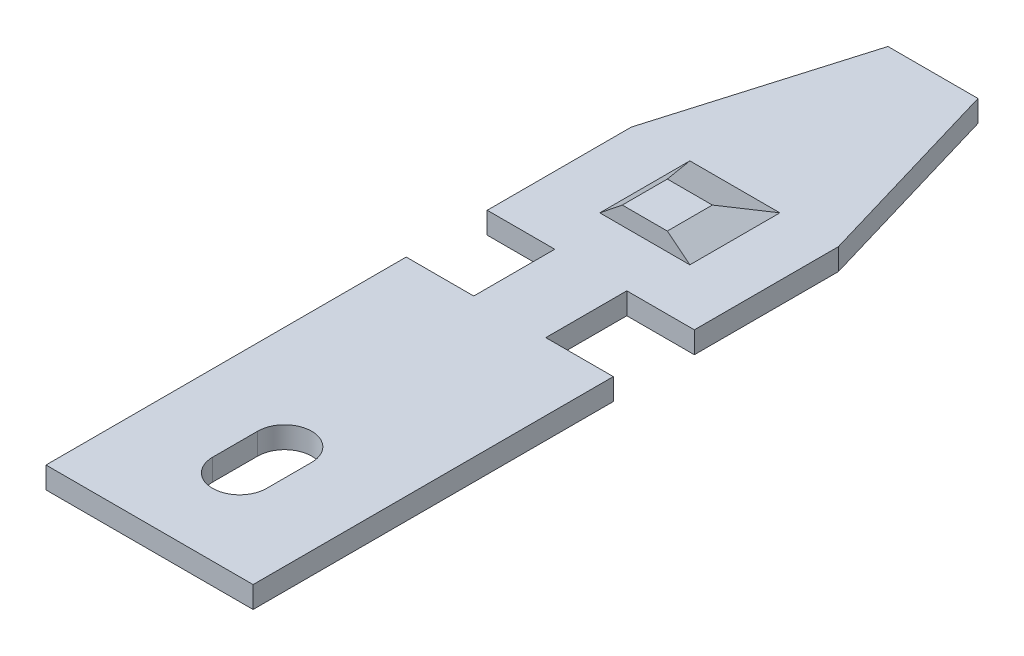
ISO-10303-21;
HEADER;
FILE_DESCRIPTION(('STEP AP214'),'2;1');
FILE_NAME('part.step','',(''),(''),'','','');
FILE_SCHEMA(('AUTOMOTIVE_DESIGN { 1 0 10303 214 1 1 1 1 }'));
ENDSEC;
DATA;
#1=APPLICATION_CONTEXT('core data for automotive mechanical design processes');
#2=APPLICATION_PROTOCOL_DEFINITION('international standard','automotive_design',2000,#1);
#3=PRODUCT_CONTEXT('',#1,'mechanical');
#4=PRODUCT('Part','Part','',(#3));
#5=PRODUCT_RELATED_PRODUCT_CATEGORY('part','',(#4));
#6=PRODUCT_DEFINITION_FORMATION('','',#4);
#7=PRODUCT_DEFINITION_CONTEXT('part definition',#1,'design');
#8=PRODUCT_DEFINITION('design','',#6,#7);
#9=PRODUCT_DEFINITION_SHAPE('','',#8);
#10=(LENGTH_UNIT() NAMED_UNIT(*) SI_UNIT(.MILLI.,.METRE.));
#11=(NAMED_UNIT(*) PLANE_ANGLE_UNIT() SI_UNIT($,.RADIAN.));
#12=(NAMED_UNIT(*) SI_UNIT($,.STERADIAN.) SOLID_ANGLE_UNIT());
#13=UNCERTAINTY_MEASURE_WITH_UNIT(LENGTH_MEASURE(1.E-05),#10,'distance_accuracy_value','');
#14=(GEOMETRIC_REPRESENTATION_CONTEXT(3) GLOBAL_UNCERTAINTY_ASSIGNED_CONTEXT((#13)) GLOBAL_UNIT_ASSIGNED_CONTEXT((#10,
#11,#12)) REPRESENTATION_CONTEXT('',''));
#15=CARTESIAN_POINT('',(0.,0.,0.));
#16=DIRECTION('',(0.,0.,1.));
#17=DIRECTION('',(1.,0.,0.));
#18=AXIS2_PLACEMENT_3D('',#15,#16,#17);
#19=CARTESIAN_POINT('',(-9.03077726147589,0.,-6.985));
#20=DIRECTION('',(0.,0.,1.));
#21=DIRECTION('',(1.,0.,0.));
#22=AXIS2_PLACEMENT_3D('',#19,#20,#21);
#23=PLANE('',#22);
#24=DIRECTION('',(-0.78086880944303,0.624695047554424,0.));
#25=VECTOR('',#24,1.);
#26=CARTESIAN_POINT('',(0.635,0.,-6.985));
#27=LINE('',#26,#25);
#28=CARTESIAN_POINT('',(0.635,0.,-6.985));
#29=VERTEX_POINT('',#28);
#30=CARTESIAN_POINT('',(0.3175,0.254,-6.9849825));
#31=VERTEX_POINT('',#30);
#32=EDGE_CURVE('E821',#29,#31,#27,.T.);
#33=ORIENTED_EDGE('',*,*,#32,.F.);
#34=DIRECTION('',(1.,0.,0.));
#35=VECTOR('',#34,1.);
#36=CARTESIAN_POINT('',(-9.03077726147589,0.,-6.985));
#37=LINE('',#36,#35);
#38=CARTESIAN_POINT('',(-0.635,0.,-6.985));
#39=VERTEX_POINT('',#38);
#40=EDGE_CURVE('E280',#39,#29,#37,.T.);
#41=ORIENTED_EDGE('',*,*,#40,.F.);
#42=DIRECTION('',(-0.780868809443031,-0.624695047554424,0.));
#43=VECTOR('',#42,1.);
#44=CARTESIAN_POINT('',(-0.3175,0.254,-6.985));
#45=LINE('',#44,#43);
#46=CARTESIAN_POINT('',(-0.3175,0.254,-6.985));
#47=VERTEX_POINT('',#46);
#48=EDGE_CURVE('E863',#47,#39,#45,.T.);
#49=ORIENTED_EDGE('',*,*,#48,.F.);
#50=DIRECTION('',(1.,0.,0.));
#51=VECTOR('',#50,1.);
#52=CARTESIAN_POINT('',(-0.3175,0.254,-6.985));
#53=LINE('',#52,#51);
#54=EDGE_CURVE('E110',#47,#31,#53,.T.);
#55=ORIENTED_EDGE('',*,*,#54,.T.);
#56=EDGE_LOOP('',(#33,#41,#49,#55));
#57=FACE_BOUND('',#56,.T.);
#58=ADVANCED_FACE('F56',(#57),#23,.F.);
#59=CARTESIAN_POINT('',(0.,0.3048,0.));
#60=DIRECTION('',(0.,0.,-1.));
#61=DIRECTION('',(-1.,0.,0.));
#62=AXIS2_PLACEMENT_3D('',#59,#60,#61);
#63=PLANE('',#62);
#64=DIRECTION('',(1.,0.,0.));
#65=VECTOR('',#64,1.);
#66=CARTESIAN_POINT('',(0.,0.,0.));
#67=LINE('',#66,#65);
#68=CARTESIAN_POINT('',(-1.4605,0.,0.));
#69=VERTEX_POINT('',#68);
#70=CARTESIAN_POINT('',(1.4605,0.,0.));
#71=VERTEX_POINT('',#70);
#72=EDGE_CURVE('E378',#69,#71,#67,.T.);
#73=ORIENTED_EDGE('',*,*,#72,.T.);
#74=DIRECTION('',(0.,-1.,0.));
#75=VECTOR('',#74,1.);
#76=CARTESIAN_POINT('',(1.4605,0.3048,0.));
#77=LINE('',#76,#75);
#78=CARTESIAN_POINT('',(1.4605,0.3048,0.));
#79=VERTEX_POINT('',#78);
#80=EDGE_CURVE('E12',#79,#71,#77,.T.);
#81=ORIENTED_EDGE('',*,*,#80,.F.);
#82=DIRECTION('',(1.,0.,0.));
#83=VECTOR('',#82,1.);
#84=CARTESIAN_POINT('',(0.,0.3048,0.));
#85=LINE('',#84,#83);
#86=CARTESIAN_POINT('',(-1.4605,0.3048,0.));
#87=VERTEX_POINT('',#86);
#88=EDGE_CURVE('E262',#87,#79,#85,.T.);
#89=ORIENTED_EDGE('',*,*,#88,.F.);
#90=DIRECTION('',(0.,-1.,0.));
#91=VECTOR('',#90,1.);
#92=CARTESIAN_POINT('',(-1.4605,0.3048,0.));
#93=LINE('',#92,#91);
#94=EDGE_CURVE('E350',#87,#69,#93,.T.);
#95=ORIENTED_EDGE('',*,*,#94,.T.);
#96=EDGE_LOOP('',(#73,#81,#89,#95));
#97=FACE_BOUND('',#96,.T.);
#98=ADVANCED_FACE('F58',(#97),#63,.F.);
#99=CARTESIAN_POINT('',(1.4605,0.3048,0.));
#100=DIRECTION('',(-1.,0.,0.));
#101=DIRECTION('',(0.,0.,1.));
#102=AXIS2_PLACEMENT_3D('',#99,#100,#101);
#103=PLANE('',#102);
#104=DIRECTION('',(0.,0.,-1.));
#105=VECTOR('',#104,1.);
#106=CARTESIAN_POINT('',(1.4605,0.,0.));
#107=LINE('',#106,#105);
#108=CARTESIAN_POINT('',(1.4605,0.,-5.08));
#109=VERTEX_POINT('',#108);
#110=EDGE_CURVE('E393',#71,#109,#107,.T.);
#111=ORIENTED_EDGE('',*,*,#110,.T.);
#112=DIRECTION('',(0.,-1.,0.));
#113=VECTOR('',#112,1.);
#114=CARTESIAN_POINT('',(1.4605,0.3048,-5.08));
#115=LINE('',#114,#113);
#116=CARTESIAN_POINT('',(1.4605,0.3048,-5.08));
#117=VERTEX_POINT('',#116);
#118=EDGE_CURVE('E66',#117,#109,#115,.T.);
#119=ORIENTED_EDGE('',*,*,#118,.F.);
#120=DIRECTION('',(0.,0.,-1.));
#121=VECTOR('',#120,1.);
#122=CARTESIAN_POINT('',(1.4605,0.3048,0.));
#123=LINE('',#122,#121);
#124=EDGE_CURVE('E264',#79,#117,#123,.T.);
#125=ORIENTED_EDGE('',*,*,#124,.F.);
#126=ORIENTED_EDGE('',*,*,#80,.T.);
#127=EDGE_LOOP('',(#111,#119,#125,#126));
#128=FACE_BOUND('',#127,.T.);
#129=ADVANCED_FACE('F421',(#128),#103,.F.);
#130=CARTESIAN_POINT('',(1.4605,0.3048,-5.08));
#131=DIRECTION('',(0.,0.,1.));
#132=DIRECTION('',(1.,0.,0.));
#133=AXIS2_PLACEMENT_3D('',#130,#131,#132);
#134=PLANE('',#133);
#135=DIRECTION('',(-1.,0.,0.));
#136=VECTOR('',#135,1.);
#137=CARTESIAN_POINT('',(1.4605,0.,-5.08));
#138=LINE('',#137,#136);
#139=CARTESIAN_POINT('',(0.508000000000001,0.,-5.08));
#140=VERTEX_POINT('',#139);
#141=EDGE_CURVE('E395',#109,#140,#138,.T.);
#142=ORIENTED_EDGE('',*,*,#141,.T.);
#143=DIRECTION('',(0.,-1.,0.));
#144=VECTOR('',#143,1.);
#145=CARTESIAN_POINT('',(0.508000000000001,0.3048,-5.08));
#146=LINE('',#145,#144);
#147=CARTESIAN_POINT('',(0.508000000000001,0.3048,-5.08));
#148=VERTEX_POINT('',#147);
#149=EDGE_CURVE('E275',#148,#140,#146,.T.);
#150=ORIENTED_EDGE('',*,*,#149,.F.);
#151=DIRECTION('',(-1.,0.,0.));
#152=VECTOR('',#151,1.);
#153=CARTESIAN_POINT('',(1.4605,0.3048,-5.08));
#154=LINE('',#153,#152);
#155=EDGE_CURVE('E381',#117,#148,#154,.T.);
#156=ORIENTED_EDGE('',*,*,#155,.F.);
#157=ORIENTED_EDGE('',*,*,#118,.T.);
#158=EDGE_LOOP('',(#142,#150,#156,#157));
#159=FACE_BOUND('',#158,.T.);
#160=ADVANCED_FACE('F417',(#159),#134,.F.);
#161=CARTESIAN_POINT('',(0.508000000000001,0.3048,-5.08));
#162=DIRECTION('',(-1.,0.,0.));
#163=DIRECTION('',(0.,0.,1.));
#164=AXIS2_PLACEMENT_3D('',#161,#162,#163);
#165=PLANE('',#164);
#166=DIRECTION('',(0.,0.,-1.));
#167=VECTOR('',#166,1.);
#168=CARTESIAN_POINT('',(0.508000000000001,0.,-5.08));
#169=LINE('',#168,#167);
#170=CARTESIAN_POINT('',(0.508000000000001,0.,-6.223));
#171=VERTEX_POINT('',#170);
#172=EDGE_CURVE('E397',#140,#171,#169,.T.);
#173=ORIENTED_EDGE('',*,*,#172,.T.);
#174=DIRECTION('',(0.,-1.,0.));
#175=VECTOR('',#174,1.);
#176=CARTESIAN_POINT('',(0.508000000000001,0.3048,-6.223));
#177=LINE('',#176,#175);
#178=CARTESIAN_POINT('',(0.508000000000001,0.3048,-6.223));
#179=VERTEX_POINT('',#178);
#180=EDGE_CURVE('E272',#179,#171,#177,.T.);
#181=ORIENTED_EDGE('',*,*,#180,.F.);
#182=DIRECTION('',(0.,0.,-1.));
#183=VECTOR('',#182,1.);
#184=CARTESIAN_POINT('',(0.508000000000001,0.3048,-5.08));
#185=LINE('',#184,#183);
#186=EDGE_CURVE('E383',#148,#179,#185,.T.);
#187=ORIENTED_EDGE('',*,*,#186,.F.);
#188=ORIENTED_EDGE('',*,*,#149,.T.);
#189=EDGE_LOOP('',(#173,#181,#187,#188));
#190=FACE_BOUND('',#189,.T.);
#191=ADVANCED_FACE('F413',(#190),#165,.F.);
#192=CARTESIAN_POINT('',(0.508000000000001,0.3048,-6.223));
#193=DIRECTION('',(0.,0.,-1.));
#194=DIRECTION('',(-1.,0.,0.));
#195=AXIS2_PLACEMENT_3D('',#192,#193,#194);
#196=PLANE('',#195);
#197=DIRECTION('',(1.,0.,0.));
#198=VECTOR('',#197,1.);
#199=CARTESIAN_POINT('',(0.508000000000001,0.,-6.223));
#200=LINE('',#199,#198);
#201=CARTESIAN_POINT('',(1.4605,0.,-6.223));
#202=VERTEX_POINT('',#201);
#203=EDGE_CURVE('E399',#171,#202,#200,.T.);
#204=ORIENTED_EDGE('',*,*,#203,.T.);
#205=DIRECTION('',(0.,-1.,0.));
#206=VECTOR('',#205,1.);
#207=CARTESIAN_POINT('',(1.4605,0.3048,-6.223));
#208=LINE('',#207,#206);
#209=CARTESIAN_POINT('',(1.4605,0.3048,-6.223));
#210=VERTEX_POINT('',#209);
#211=EDGE_CURVE('E269',#210,#202,#208,.T.);
#212=ORIENTED_EDGE('',*,*,#211,.F.);
#213=DIRECTION('',(1.,0.,0.));
#214=VECTOR('',#213,1.);
#215=CARTESIAN_POINT('',(0.508000000000001,0.3048,-6.223));
#216=LINE('',#215,#214);
#217=EDGE_CURVE('E385',#179,#210,#216,.T.);
#218=ORIENTED_EDGE('',*,*,#217,.F.);
#219=ORIENTED_EDGE('',*,*,#180,.T.);
#220=EDGE_LOOP('',(#204,#212,#218,#219));
#221=FACE_BOUND('',#220,.T.);
#222=ADVANCED_FACE('F408',(#221),#196,.F.);
#223=CARTESIAN_POINT('',(1.4605,0.3048,-6.223));
#224=DIRECTION('',(-1.,0.,0.));
#225=DIRECTION('',(0.,0.,1.));
#226=AXIS2_PLACEMENT_3D('',#223,#224,#225);
#227=PLANE('',#226);
#228=DIRECTION('',(0.,0.,-1.));
#229=VECTOR('',#228,1.);
#230=CARTESIAN_POINT('',(1.4605,0.,-6.223));
#231=LINE('',#230,#229);
#232=CARTESIAN_POINT('',(1.4605,0.,-8.255));
#233=VERTEX_POINT('',#232);
#234=EDGE_CURVE('E249',#202,#233,#231,.T.);
#235=ORIENTED_EDGE('',*,*,#234,.T.);
#236=DIRECTION('',(0.,-1.,0.));
#237=VECTOR('',#236,1.);
#238=CARTESIAN_POINT('',(1.4605,0.3048,-8.255));
#239=LINE('',#238,#237);
#240=CARTESIAN_POINT('',(1.4605,0.3048,-8.255));
#241=VERTEX_POINT('',#240);
#242=EDGE_CURVE('E244',#241,#233,#239,.T.);
#243=ORIENTED_EDGE('',*,*,#242,.F.);
#244=DIRECTION('',(0.,0.,-1.));
#245=VECTOR('',#244,1.);
#246=CARTESIAN_POINT('',(1.4605,0.3048,-6.223));
#247=LINE('',#246,#245);
#248=EDGE_CURVE('E387',#210,#241,#247,.T.);
#249=ORIENTED_EDGE('',*,*,#248,.F.);
#250=ORIENTED_EDGE('',*,*,#211,.T.);
#251=EDGE_LOOP('',(#235,#243,#249,#250));
#252=FACE_BOUND('',#251,.T.);
#253=ADVANCED_FACE('F401',(#252),#227,.F.);
#254=CARTESIAN_POINT('',(1.4605,0.3048,-8.255));
#255=DIRECTION('',(-0.9590177080589,0.,0.283346141017403));
#256=DIRECTION('',(0.283346141017403,0.,0.9590177080589));
#257=AXIS2_PLACEMENT_3D('',#254,#255,#256);
#258=PLANE('',#257);
#259=DIRECTION('',(-0.283346141017403,0.,-0.9590177080589));
#260=VECTOR('',#259,1.);
#261=CARTESIAN_POINT('',(1.4605,0.,-8.255));
#262=LINE('',#261,#260);
#263=CARTESIAN_POINT('',(0.635,0.,-11.049));
#264=VERTEX_POINT('',#263);
#265=EDGE_CURVE('E237',#233,#264,#262,.T.);
#266=ORIENTED_EDGE('',*,*,#265,.T.);
#267=DIRECTION('',(0.,-1.,0.));
#268=VECTOR('',#267,1.);
#269=CARTESIAN_POINT('',(0.635,0.3048,-11.049));
#270=LINE('',#269,#268);
#271=CARTESIAN_POINT('',(0.635,0.3048,-11.049));
#272=VERTEX_POINT('',#271);
#273=EDGE_CURVE('E241',#272,#264,#270,.T.);
#274=ORIENTED_EDGE('',*,*,#273,.F.);
#275=DIRECTION('',(-0.283346141017403,0.,-0.9590177080589));
#276=VECTOR('',#275,1.);
#277=CARTESIAN_POINT('',(1.4605,0.3048,-8.255));
#278=LINE('',#277,#276);
#279=EDGE_CURVE('E389',#241,#272,#278,.T.);
#280=ORIENTED_EDGE('',*,*,#279,.F.);
#281=ORIENTED_EDGE('',*,*,#242,.T.);
#282=EDGE_LOOP('',(#266,#274,#280,#281));
#283=FACE_BOUND('',#282,.T.);
#284=ADVANCED_FACE('F239',(#283),#258,.F.);
#285=CARTESIAN_POINT('',(0.635,0.3048,-11.049));
#286=DIRECTION('',(0.,0.,1.));
#287=DIRECTION('',(1.,0.,0.));
#288=AXIS2_PLACEMENT_3D('',#285,#286,#287);
#289=PLANE('',#288);
#290=DIRECTION('',(-1.,0.,0.));
#291=VECTOR('',#290,1.);
#292=CARTESIAN_POINT('',(0.635,0.,-11.049));
#293=LINE('',#292,#291);
#294=CARTESIAN_POINT('',(-0.635000000000001,0.,-11.049));
#295=VERTEX_POINT('',#294);
#296=EDGE_CURVE('E248',#264,#295,#293,.T.);
#297=ORIENTED_EDGE('',*,*,#296,.T.);
#298=DIRECTION('',(0.,-1.,0.));
#299=VECTOR('',#298,1.);
#300=CARTESIAN_POINT('',(-0.635000000000001,0.3048,-11.049));
#301=LINE('',#300,#299);
#302=CARTESIAN_POINT('',(-0.635000000000001,0.3048,-11.049));
#303=VERTEX_POINT('',#302);
#304=EDGE_CURVE('E377',#303,#295,#301,.T.);
#305=ORIENTED_EDGE('',*,*,#304,.F.);
#306=DIRECTION('',(-1.,0.,0.));
#307=VECTOR('',#306,1.);
#308=CARTESIAN_POINT('',(0.635,0.3048,-11.049));
#309=LINE('',#308,#307);
#310=EDGE_CURVE('E255',#272,#303,#309,.T.);
#311=ORIENTED_EDGE('',*,*,#310,.F.);
#312=ORIENTED_EDGE('',*,*,#273,.T.);
#313=EDGE_LOOP('',(#297,#305,#311,#312));
#314=FACE_BOUND('',#313,.T.);
#315=ADVANCED_FACE('F252',(#314),#289,.F.);
#316=CARTESIAN_POINT('',(0.,0.3048,0.));
#317=DIRECTION('',(0.,1.,0.));
#318=DIRECTION('',(0.,0.,1.));
#319=AXIS2_PLACEMENT_3D('',#316,#317,#318);
#320=PLANE('',#319);
#321=DIRECTION('',(1.,0.,0.));
#322=VECTOR('',#321,1.);
#323=CARTESIAN_POINT('',(-9.03077726147589,0.3048,-6.985));
#324=LINE('',#323,#322);
#325=CARTESIAN_POINT('',(-0.635,0.3048,-6.985));
#326=VERTEX_POINT('',#325);
#327=CARTESIAN_POINT('',(0.635,0.3048,-6.985));
#328=VERTEX_POINT('',#327);
#329=EDGE_CURVE('E100',#326,#328,#324,.T.);
#330=ORIENTED_EDGE('',*,*,#329,.F.);
#331=CARTESIAN_POINT('',(-0.635,0.3048,-6.985));
#332=DIRECTION('',(0.,0.,-1.));
#333=VECTOR('',#332,1.);
#334=LINE('',#331,#333);
#335=CARTESIAN_POINT('',(-0.635,0.3048,-8.255));
#336=VERTEX_POINT('',#335);
#337=EDGE_CURVE('E284',#326,#336,#334,.T.);
#338=ORIENTED_EDGE('',*,*,#337,.T.);
#339=CARTESIAN_POINT('',(-0.635,0.3048,-8.255));
#340=DIRECTION('',(1.,0.,0.));
#341=VECTOR('',#340,1.);
#342=LINE('',#339,#341);
#343=CARTESIAN_POINT('',(0.635,0.3048,-8.255));
#344=VERTEX_POINT('',#343);
#345=EDGE_CURVE('E755',#336,#344,#342,.T.);
#346=ORIENTED_EDGE('',*,*,#345,.T.);
#347=DIRECTION('',(0.,0.,1.));
#348=VECTOR('',#347,1.);
#349=CARTESIAN_POINT('',(0.635,0.3048,-6.985));
#350=LINE('',#349,#348);
#351=EDGE_CURVE('E289',#328,#344,#350,.F.);
#352=ORIENTED_EDGE('',*,*,#351,.F.);
#353=EDGE_LOOP('',(#330,#338,#346,#352));
#354=FACE_BOUND('',#353,.T.);
#355=CARTESIAN_POINT('',(0.,0.3048,-1.905));
#356=DIRECTION('',(0.,1.,0.));
#357=DIRECTION('',(0.,0.,1.));
#358=AXIS2_PLACEMENT_3D('',#355,#356,#357);
#359=CIRCLE('',#358,0.381);
#360=CARTESIAN_POINT('',(0.381,0.3048,-1.905));
#361=VERTEX_POINT('',#360);
#362=CARTESIAN_POINT('',(-0.381,0.3048,-1.905));
#363=VERTEX_POINT('',#362);
#364=EDGE_CURVE('E75',#361,#363,#359,.T.);
#365=ORIENTED_EDGE('',*,*,#364,.F.);
#366=DIRECTION('',(0.,0.,-1.));
#367=VECTOR('',#366,1.);
#368=CARTESIAN_POINT('',(0.381,0.3048,-1.905));
#369=LINE('',#368,#367);
#370=CARTESIAN_POINT('',(0.381,0.3048,-1.27));
#371=VERTEX_POINT('',#370);
#372=EDGE_CURVE('E304',#371,#361,#369,.T.);
#373=ORIENTED_EDGE('',*,*,#372,.F.);
#374=CARTESIAN_POINT('',(0.,0.3048,-1.27));
#375=DIRECTION('',(0.,1.,0.));
#376=DIRECTION('',(0.,0.,1.));
#377=AXIS2_PLACEMENT_3D('',#374,#375,#376);
#378=CIRCLE('',#377,0.381);
#379=CARTESIAN_POINT('',(-0.381,0.3048,-1.27));
#380=VERTEX_POINT('',#379);
#381=EDGE_CURVE('E319',#380,#371,#378,.T.);
#382=ORIENTED_EDGE('',*,*,#381,.F.);
#383=DIRECTION('',(0.,0.,1.));
#384=VECTOR('',#383,1.);
#385=CARTESIAN_POINT('',(-0.381,0.3048,-1.905));
#386=LINE('',#385,#384);
#387=EDGE_CURVE('E315',#363,#380,#386,.T.);
#388=ORIENTED_EDGE('',*,*,#387,.F.);
#389=EDGE_LOOP('',(#365,#373,#382,#388));
#390=FACE_BOUND('',#389,.T.);
#391=ORIENTED_EDGE('',*,*,#310,.T.);
#392=DIRECTION('',(0.283346141017403,0.,-0.9590177080589));
#393=VECTOR('',#392,1.);
#394=CARTESIAN_POINT('',(-1.4605,0.3048,-8.255));
#395=LINE('',#394,#393);
#396=CARTESIAN_POINT('',(-1.4605,0.3048,-8.255));
#397=VERTEX_POINT('',#396);
#398=EDGE_CURVE('E331',#397,#303,#395,.T.);
#399=ORIENTED_EDGE('',*,*,#398,.F.);
#400=DIRECTION('',(0.,0.,-1.));
#401=VECTOR('',#400,1.);
#402=CARTESIAN_POINT('',(-1.4605,0.3048,-6.223));
#403=LINE('',#402,#401);
#404=CARTESIAN_POINT('',(-1.4605,0.3048,-6.223));
#405=VERTEX_POINT('',#404);
#406=EDGE_CURVE('E334',#405,#397,#403,.T.);
#407=ORIENTED_EDGE('',*,*,#406,.F.);
#408=DIRECTION('',(-1.,0.,0.));
#409=VECTOR('',#408,1.);
#410=CARTESIAN_POINT('',(-0.508000000000001,0.3048,-6.223));
#411=LINE('',#410,#409);
#412=CARTESIAN_POINT('',(-0.508000000000001,0.3048,-6.223));
#413=VERTEX_POINT('',#412);
#414=EDGE_CURVE('E338',#413,#405,#411,.T.);
#415=ORIENTED_EDGE('',*,*,#414,.F.);
#416=DIRECTION('',(0.,0.,-1.));
#417=VECTOR('',#416,1.);
#418=CARTESIAN_POINT('',(-0.508000000000001,0.3048,-5.08));
#419=LINE('',#418,#417);
#420=CARTESIAN_POINT('',(-0.508000000000001,0.3048,-5.08));
#421=VERTEX_POINT('',#420);
#422=EDGE_CURVE('E341',#421,#413,#419,.T.);
#423=ORIENTED_EDGE('',*,*,#422,.F.);
#424=DIRECTION('',(1.,0.,0.));
#425=VECTOR('',#424,1.);
#426=CARTESIAN_POINT('',(-1.4605,0.3048,-5.08));
#427=LINE('',#426,#425);
#428=CARTESIAN_POINT('',(-1.4605,0.3048,-5.08));
#429=VERTEX_POINT('',#428);
#430=EDGE_CURVE('E344',#429,#421,#427,.T.);
#431=ORIENTED_EDGE('',*,*,#430,.F.);
#432=DIRECTION('',(0.,0.,-1.));
#433=VECTOR('',#432,1.);
#434=CARTESIAN_POINT('',(-1.4605,0.3048,0.));
#435=LINE('',#434,#433);
#436=EDGE_CURVE('E347',#87,#429,#435,.T.);
#437=ORIENTED_EDGE('',*,*,#436,.F.);
#438=ORIENTED_EDGE('',*,*,#88,.T.);
#439=ORIENTED_EDGE('',*,*,#124,.T.);
#440=ORIENTED_EDGE('',*,*,#155,.T.);
#441=ORIENTED_EDGE('',*,*,#186,.T.);
#442=ORIENTED_EDGE('',*,*,#217,.T.);
#443=ORIENTED_EDGE('',*,*,#248,.T.);
#444=ORIENTED_EDGE('',*,*,#279,.T.);
#445=EDGE_LOOP('',(#391,#399,#407,#415,#423,#431,#437,#438,#439,#440,#441,#442,#443,#444));
#446=FACE_BOUND('',#445,.T.);
#447=ADVANCED_FACE('F450',(#354,#390,#446),#320,.T.);
#448=CARTESIAN_POINT('',(0.,0.,0.));
#449=DIRECTION('',(0.,1.,0.));
#450=DIRECTION('',(0.,0.,1.));
#451=AXIS2_PLACEMENT_3D('',#448,#449,#450);
#452=PLANE('',#451);
#453=CARTESIAN_POINT('',(-0.635,0.,-6.985));
#454=DIRECTION('',(0.,0.,-1.));
#455=VECTOR('',#454,1.);
#456=LINE('',#453,#455);
#457=CARTESIAN_POINT('',(-0.635,0.,-8.255));
#458=VERTEX_POINT('',#457);
#459=EDGE_CURVE('E316',#39,#458,#456,.T.);
#460=ORIENTED_EDGE('',*,*,#459,.F.);
#461=ORIENTED_EDGE('',*,*,#40,.T.);
#462=DIRECTION('',(0.,0.,1.));
#463=VECTOR('',#462,1.);
#464=CARTESIAN_POINT('',(0.635,0.,0.));
#465=LINE('',#464,#463);
#466=CARTESIAN_POINT('',(0.635,0.,-8.255));
#467=VERTEX_POINT('',#466);
#468=EDGE_CURVE('E283',#29,#467,#465,.F.);
#469=ORIENTED_EDGE('',*,*,#468,.T.);
#470=CARTESIAN_POINT('',(-0.635,0.,-8.255));
#471=DIRECTION('',(1.,0.,0.));
#472=VECTOR('',#471,1.);
#473=LINE('',#470,#472);
#474=EDGE_CURVE('E932',#458,#467,#473,.T.);
#475=ORIENTED_EDGE('',*,*,#474,.F.);
#476=EDGE_LOOP('',(#460,#461,#469,#475));
#477=FACE_BOUND('',#476,.T.);
#478=DIRECTION('',(0.,0.,-1.));
#479=VECTOR('',#478,1.);
#480=CARTESIAN_POINT('',(0.381,0.,-1.905));
#481=LINE('',#480,#479);
#482=CARTESIAN_POINT('',(0.381,0.,-1.27));
#483=VERTEX_POINT('',#482);
#484=CARTESIAN_POINT('',(0.381,0.,-1.905));
#485=VERTEX_POINT('',#484);
#486=EDGE_CURVE('E310',#483,#485,#481,.T.);
#487=ORIENTED_EDGE('',*,*,#486,.T.);
#488=CARTESIAN_POINT('',(0.,0.,-1.905));
#489=DIRECTION('',(0.,1.,0.));
#490=DIRECTION('',(0.,0.,1.));
#491=AXIS2_PLACEMENT_3D('',#488,#489,#490);
#492=CIRCLE('',#491,0.381);
#493=CARTESIAN_POINT('',(-0.381,0.,-1.905));
#494=VERTEX_POINT('',#493);
#495=EDGE_CURVE('E300',#485,#494,#492,.T.);
#496=ORIENTED_EDGE('',*,*,#495,.T.);
#497=DIRECTION('',(0.,0.,1.));
#498=VECTOR('',#497,1.);
#499=CARTESIAN_POINT('',(-0.381,0.,-1.905));
#500=LINE('',#499,#498);
#501=CARTESIAN_POINT('',(-0.381,0.,-1.27));
#502=VERTEX_POINT('',#501);
#503=EDGE_CURVE('E303',#494,#502,#500,.T.);
#504=ORIENTED_EDGE('',*,*,#503,.T.);
#505=CARTESIAN_POINT('',(0.,0.,-1.27));
#506=DIRECTION('',(0.,1.,0.));
#507=DIRECTION('',(0.,0.,1.));
#508=AXIS2_PLACEMENT_3D('',#505,#506,#507);
#509=CIRCLE('',#508,0.381);
#510=EDGE_CURVE('E307',#502,#483,#509,.T.);
#511=ORIENTED_EDGE('',*,*,#510,.T.);
#512=EDGE_LOOP('',(#487,#496,#504,#511));
#513=FACE_BOUND('',#512,.T.);
#514=ORIENTED_EDGE('',*,*,#72,.F.);
#515=DIRECTION('',(0.,0.,-1.));
#516=VECTOR('',#515,1.);
#517=CARTESIAN_POINT('',(-1.4605,0.,0.));
#518=LINE('',#517,#516);
#519=CARTESIAN_POINT('',(-1.4605,0.,-5.08));
#520=VERTEX_POINT('',#519);
#521=EDGE_CURVE('E335',#69,#520,#518,.T.);
#522=ORIENTED_EDGE('',*,*,#521,.T.);
#523=DIRECTION('',(1.,0.,0.));
#524=VECTOR('',#523,1.);
#525=CARTESIAN_POINT('',(-1.4605,0.,-5.08));
#526=LINE('',#525,#524);
#527=CARTESIAN_POINT('',(-0.508000000000001,0.,-5.08));
#528=VERTEX_POINT('',#527);
#529=EDGE_CURVE('E360',#520,#528,#526,.T.);
#530=ORIENTED_EDGE('',*,*,#529,.T.);
#531=DIRECTION('',(0.,0.,-1.));
#532=VECTOR('',#531,1.);
#533=CARTESIAN_POINT('',(-0.508000000000001,0.,-5.08));
#534=LINE('',#533,#532);
#535=CARTESIAN_POINT('',(-0.508000000000001,0.,-6.223));
#536=VERTEX_POINT('',#535);
#537=EDGE_CURVE('E357',#528,#536,#534,.T.);
#538=ORIENTED_EDGE('',*,*,#537,.T.);
#539=DIRECTION('',(-1.,0.,0.));
#540=VECTOR('',#539,1.);
#541=CARTESIAN_POINT('',(-0.508000000000001,0.,-6.223));
#542=LINE('',#541,#540);
#543=CARTESIAN_POINT('',(-1.4605,0.,-6.223));
#544=VERTEX_POINT('',#543);
#545=EDGE_CURVE('E354',#536,#544,#542,.T.);
#546=ORIENTED_EDGE('',*,*,#545,.T.);
#547=DIRECTION('',(0.,0.,-1.));
#548=VECTOR('',#547,1.);
#549=CARTESIAN_POINT('',(-1.4605,0.,-6.223));
#550=LINE('',#549,#548);
#551=CARTESIAN_POINT('',(-1.4605,0.,-8.255));
#552=VERTEX_POINT('',#551);
#553=EDGE_CURVE('E352',#544,#552,#550,.T.);
#554=ORIENTED_EDGE('',*,*,#553,.T.);
#555=DIRECTION('',(0.283346141017403,0.,-0.9590177080589));
#556=VECTOR('',#555,1.);
#557=CARTESIAN_POINT('',(-1.4605,0.,-8.255));
#558=LINE('',#557,#556);
#559=EDGE_CURVE('E261',#552,#295,#558,.T.);
#560=ORIENTED_EDGE('',*,*,#559,.T.);
#561=ORIENTED_EDGE('',*,*,#296,.F.);
#562=ORIENTED_EDGE('',*,*,#265,.F.);
#563=ORIENTED_EDGE('',*,*,#234,.F.);
#564=ORIENTED_EDGE('',*,*,#203,.F.);
#565=ORIENTED_EDGE('',*,*,#172,.F.);
#566=ORIENTED_EDGE('',*,*,#141,.F.);
#567=ORIENTED_EDGE('',*,*,#110,.F.);
#568=EDGE_LOOP('',(#514,#522,#530,#538,#546,#554,#560,#561,#562,#563,#564,#565,#566,#567));
#569=FACE_BOUND('',#568,.T.);
#570=ADVANCED_FACE('F258',(#477,#513,#569),#452,.F.);
#571=CARTESIAN_POINT('',(-1.4605,0.3048,-8.255));
#572=DIRECTION('',(-0.9590177080589,0.,-0.283346141017403));
#573=DIRECTION('',(-0.283346141017403,0.,0.9590177080589));
#574=AXIS2_PLACEMENT_3D('',#571,#572,#573);
#575=PLANE('',#574);
#576=ORIENTED_EDGE('',*,*,#559,.F.);
#577=DIRECTION('',(0.,-1.,0.));
#578=VECTOR('',#577,1.);
#579=CARTESIAN_POINT('',(-1.4605,0.3048,-8.255));
#580=LINE('',#579,#578);
#581=EDGE_CURVE('E375',#397,#552,#580,.T.);
#582=ORIENTED_EDGE('',*,*,#581,.F.);
#583=ORIENTED_EDGE('',*,*,#398,.T.);
#584=ORIENTED_EDGE('',*,*,#304,.T.);
#585=EDGE_LOOP('',(#576,#582,#583,#584));
#586=FACE_BOUND('',#585,.T.);
#587=ADVANCED_FACE('F448',(#586),#575,.T.);
#588=CARTESIAN_POINT('',(-1.4605,0.3048,-6.223));
#589=DIRECTION('',(-1.,0.,0.));
#590=DIRECTION('',(0.,0.,1.));
#591=AXIS2_PLACEMENT_3D('',#588,#589,#590);
#592=PLANE('',#591);
#593=ORIENTED_EDGE('',*,*,#553,.F.);
#594=DIRECTION('',(0.,-1.,0.));
#595=VECTOR('',#594,1.);
#596=CARTESIAN_POINT('',(-1.4605,0.3048,-6.223));
#597=LINE('',#596,#595);
#598=EDGE_CURVE('E373',#405,#544,#597,.T.);
#599=ORIENTED_EDGE('',*,*,#598,.F.);
#600=ORIENTED_EDGE('',*,*,#406,.T.);
#601=ORIENTED_EDGE('',*,*,#581,.T.);
#602=EDGE_LOOP('',(#593,#599,#600,#601));
#603=FACE_BOUND('',#602,.T.);
#604=ADVANCED_FACE('F444',(#603),#592,.T.);
#605=CARTESIAN_POINT('',(-0.508000000000001,0.3048,-6.223));
#606=DIRECTION('',(0.,0.,1.));
#607=DIRECTION('',(1.,0.,0.));
#608=AXIS2_PLACEMENT_3D('',#605,#606,#607);
#609=PLANE('',#608);
#610=ORIENTED_EDGE('',*,*,#545,.F.);
#611=DIRECTION('',(0.,-1.,0.));
#612=VECTOR('',#611,1.);
#613=CARTESIAN_POINT('',(-0.508000000000001,0.3048,-6.223));
#614=LINE('',#613,#612);
#615=EDGE_CURVE('E371',#413,#536,#614,.T.);
#616=ORIENTED_EDGE('',*,*,#615,.F.);
#617=ORIENTED_EDGE('',*,*,#414,.T.);
#618=ORIENTED_EDGE('',*,*,#598,.T.);
#619=EDGE_LOOP('',(#610,#616,#617,#618));
#620=FACE_BOUND('',#619,.T.);
#621=ADVANCED_FACE('F441',(#620),#609,.T.);
#622=CARTESIAN_POINT('',(-0.508000000000001,0.3048,-5.08));
#623=DIRECTION('',(-1.,0.,0.));
#624=DIRECTION('',(0.,0.,1.));
#625=AXIS2_PLACEMENT_3D('',#622,#623,#624);
#626=PLANE('',#625);
#627=ORIENTED_EDGE('',*,*,#537,.F.);
#628=DIRECTION('',(0.,-1.,0.));
#629=VECTOR('',#628,1.);
#630=CARTESIAN_POINT('',(-0.508000000000001,0.3048,-5.08));
#631=LINE('',#630,#629);
#632=EDGE_CURVE('E369',#421,#528,#631,.T.);
#633=ORIENTED_EDGE('',*,*,#632,.F.);
#634=ORIENTED_EDGE('',*,*,#422,.T.);
#635=ORIENTED_EDGE('',*,*,#615,.T.);
#636=EDGE_LOOP('',(#627,#633,#634,#635));
#637=FACE_BOUND('',#636,.T.);
#638=ADVANCED_FACE('F437',(#637),#626,.T.);
#639=CARTESIAN_POINT('',(-1.4605,0.3048,-5.08));
#640=DIRECTION('',(0.,0.,-1.));
#641=DIRECTION('',(-1.,0.,0.));
#642=AXIS2_PLACEMENT_3D('',#639,#640,#641);
#643=PLANE('',#642);
#644=ORIENTED_EDGE('',*,*,#529,.F.);
#645=DIRECTION('',(0.,-1.,0.));
#646=VECTOR('',#645,1.);
#647=CARTESIAN_POINT('',(-1.4605,0.3048,-5.08));
#648=LINE('',#647,#646);
#649=EDGE_CURVE('E367',#429,#520,#648,.T.);
#650=ORIENTED_EDGE('',*,*,#649,.F.);
#651=ORIENTED_EDGE('',*,*,#430,.T.);
#652=ORIENTED_EDGE('',*,*,#632,.T.);
#653=EDGE_LOOP('',(#644,#650,#651,#652));
#654=FACE_BOUND('',#653,.T.);
#655=ADVANCED_FACE('F433',(#654),#643,.T.);
#656=CARTESIAN_POINT('',(-1.4605,0.3048,0.));
#657=DIRECTION('',(-1.,0.,0.));
#658=DIRECTION('',(0.,0.,1.));
#659=AXIS2_PLACEMENT_3D('',#656,#657,#658);
#660=PLANE('',#659);
#661=ORIENTED_EDGE('',*,*,#521,.F.);
#662=ORIENTED_EDGE('',*,*,#94,.F.);
#663=ORIENTED_EDGE('',*,*,#436,.T.);
#664=ORIENTED_EDGE('',*,*,#649,.T.);
#665=EDGE_LOOP('',(#661,#662,#663,#664));
#666=FACE_BOUND('',#665,.T.);
#667=ADVANCED_FACE('F429',(#666),#660,.T.);
#668=CARTESIAN_POINT('',(0.,0.,-1.905));
#669=DIRECTION('',(0.,1.,0.));
#670=DIRECTION('',(0.,0.,1.));
#671=AXIS2_PLACEMENT_3D('',#668,#669,#670);
#672=CYLINDRICAL_SURFACE('',#671,0.381);
#673=ORIENTED_EDGE('',*,*,#364,.T.);
#674=DIRECTION('',(0.,1.,0.));
#675=VECTOR('',#674,1.);
#676=CARTESIAN_POINT('',(-0.381,0.,-1.905));
#677=LINE('',#676,#675);
#678=EDGE_CURVE('E313',#494,#363,#677,.T.);
#679=ORIENTED_EDGE('',*,*,#678,.F.);
#680=ORIENTED_EDGE('',*,*,#495,.F.);
#681=DIRECTION('',(0.,1.,0.));
#682=VECTOR('',#681,1.);
#683=CARTESIAN_POINT('',(0.381,0.,-1.905));
#684=LINE('',#683,#682);
#685=EDGE_CURVE('E324',#485,#361,#684,.T.);
#686=ORIENTED_EDGE('',*,*,#685,.T.);
#687=EDGE_LOOP('',(#673,#679,#680,#686));
#688=FACE_BOUND('',#687,.T.);
#689=ADVANCED_FACE('F477',(#688),#672,.F.);
#690=CARTESIAN_POINT('',(0.381,0.,-1.905));
#691=DIRECTION('',(1.,0.,0.));
#692=DIRECTION('',(0.,0.,-1.));
#693=AXIS2_PLACEMENT_3D('',#690,#691,#692);
#694=PLANE('',#693);
#695=ORIENTED_EDGE('',*,*,#372,.T.);
#696=ORIENTED_EDGE('',*,*,#685,.F.);
#697=ORIENTED_EDGE('',*,*,#486,.F.);
#698=DIRECTION('',(0.,1.,0.));
#699=VECTOR('',#698,1.);
#700=CARTESIAN_POINT('',(0.381,0.,-1.27));
#701=LINE('',#700,#699);
#702=EDGE_CURVE('E326',#483,#371,#701,.T.);
#703=ORIENTED_EDGE('',*,*,#702,.T.);
#704=EDGE_LOOP('',(#695,#696,#697,#703));
#705=FACE_BOUND('',#704,.T.);
#706=ADVANCED_FACE('F473',(#705),#694,.F.);
#707=CARTESIAN_POINT('',(0.,0.,-1.27));
#708=DIRECTION('',(0.,1.,0.));
#709=DIRECTION('',(0.,0.,1.));
#710=AXIS2_PLACEMENT_3D('',#707,#708,#709);
#711=CYLINDRICAL_SURFACE('',#710,0.381);
#712=ORIENTED_EDGE('',*,*,#381,.T.);
#713=ORIENTED_EDGE('',*,*,#702,.F.);
#714=ORIENTED_EDGE('',*,*,#510,.F.);
#715=DIRECTION('',(0.,1.,0.));
#716=VECTOR('',#715,1.);
#717=CARTESIAN_POINT('',(-0.381,0.,-1.27));
#718=LINE('',#717,#716);
#719=EDGE_CURVE('E328',#502,#380,#718,.T.);
#720=ORIENTED_EDGE('',*,*,#719,.T.);
#721=EDGE_LOOP('',(#712,#713,#714,#720));
#722=FACE_BOUND('',#721,.T.);
#723=ADVANCED_FACE('F476',(#722),#711,.F.);
#724=CARTESIAN_POINT('',(-0.381,0.,-1.905));
#725=DIRECTION('',(-1.,0.,0.));
#726=DIRECTION('',(0.,0.,1.));
#727=AXIS2_PLACEMENT_3D('',#724,#725,#726);
#728=PLANE('',#727);
#729=ORIENTED_EDGE('',*,*,#387,.T.);
#730=ORIENTED_EDGE('',*,*,#719,.F.);
#731=ORIENTED_EDGE('',*,*,#503,.F.);
#732=ORIENTED_EDGE('',*,*,#678,.T.);
#733=EDGE_LOOP('',(#729,#730,#731,#732));
#734=FACE_BOUND('',#733,.T.);
#735=ADVANCED_FACE('F481',(#734),#728,.F.);
#736=CARTESIAN_POINT('',(-0.3175,0.254,-6.985));
#737=DIRECTION('',(0.,0.,1.));
#738=DIRECTION('',(1.,0.,0.));
#739=AXIS2_PLACEMENT_3D('',#736,#737,#738);
#740=PLANE('',#739);
#741=DIRECTION('',(1.,0.,0.));
#742=VECTOR('',#741,1.);
#743=CARTESIAN_POINT('',(-0.3175,0.5588,-6.985));
#744=LINE('',#743,#742);
#745=CARTESIAN_POINT('',(-0.3175,0.5588,-6.985));
#746=VERTEX_POINT('',#745);
#747=CARTESIAN_POINT('',(0.3175,0.5588,-6.9849825));
#748=VERTEX_POINT('',#747);
#749=EDGE_CURVE('E760',#746,#748,#744,.T.);
#750=ORIENTED_EDGE('',*,*,#749,.F.);
#751=DIRECTION('',(-0.780868809443031,-0.624695047554424,0.));
#752=VECTOR('',#751,1.);
#753=CARTESIAN_POINT('',(-0.3175,0.5588,-6.985));
#754=LINE('',#753,#752);
#755=EDGE_CURVE('E870',#746,#326,#754,.T.);
#756=ORIENTED_EDGE('',*,*,#755,.T.);
#757=ORIENTED_EDGE('',*,*,#329,.T.);
#758=DIRECTION('',(-0.78086880944303,0.624695047554424,0.));
#759=VECTOR('',#758,1.);
#760=CARTESIAN_POINT('',(0.635,0.3048,-6.985));
#761=LINE('',#760,#759);
#762=EDGE_CURVE('E826',#328,#748,#761,.T.);
#763=ORIENTED_EDGE('',*,*,#762,.T.);
#764=EDGE_LOOP('',(#750,#756,#757,#763));
#765=FACE_BOUND('',#764,.T.);
#766=ADVANCED_FACE('F471',(#765),#740,.T.);
#767=CARTESIAN_POINT('',(-0.3175,0.254,-7.62));
#768=DIRECTION('',(0.,-1.,0.));
#769=DIRECTION('',(0.,0.,-1.));
#770=AXIS2_PLACEMENT_3D('',#767,#768,#769);
#771=PLANE('',#770);
#772=DIRECTION('',(0.,0.,1.));
#773=VECTOR('',#772,1.);
#774=CARTESIAN_POINT('',(-0.3175,0.254,-6.985));
#775=LINE('',#774,#773);
#776=CARTESIAN_POINT('',(-0.3175,0.254,-7.62));
#777=VERTEX_POINT('',#776);
#778=EDGE_CURVE('E773',#777,#47,#775,.T.);
#779=ORIENTED_EDGE('',*,*,#778,.F.);
#780=CARTESIAN_POINT('',(0.3175,0.254,-7.62));
#781=DIRECTION('',(-1.,0.,0.));
#782=VECTOR('',#781,1.);
#783=LINE('',#780,#782);
#784=CARTESIAN_POINT('',(0.3175,0.254,-7.62));
#785=VERTEX_POINT('',#784);
#786=EDGE_CURVE('E290',#785,#777,#783,.T.);
#787=ORIENTED_EDGE('',*,*,#786,.F.);
#788=CARTESIAN_POINT('',(0.3175,0.254,-6.985));
#789=DIRECTION('',(0.,0.,-1.));
#790=VECTOR('',#789,1.);
#791=LINE('',#788,#790);
#792=EDGE_CURVE('E772',#31,#785,#791,.T.);
#793=ORIENTED_EDGE('',*,*,#792,.F.);
#794=ORIENTED_EDGE('',*,*,#54,.F.);
#795=EDGE_LOOP('',(#779,#787,#793,#794));
#796=FACE_BOUND('',#795,.T.);
#797=ADVANCED_FACE('F546',(#796),#771,.T.);
#798=CARTESIAN_POINT('',(-0.3175,0.5588,-7.62));
#799=DIRECTION('',(0.,-1.,0.));
#800=DIRECTION('',(0.,0.,-1.));
#801=AXIS2_PLACEMENT_3D('',#798,#799,#800);
#802=PLANE('',#801);
#803=DIRECTION('',(0.,0.,-1.));
#804=VECTOR('',#803,1.);
#805=CARTESIAN_POINT('',(-0.3175,0.5588,-7.62));
#806=LINE('',#805,#804);
#807=CARTESIAN_POINT('',(-0.3175,0.5588,-7.62));
#808=VERTEX_POINT('',#807);
#809=EDGE_CURVE('E768',#808,#746,#806,.F.);
#810=ORIENTED_EDGE('',*,*,#809,.T.);
#811=ORIENTED_EDGE('',*,*,#749,.T.);
#812=CARTESIAN_POINT('',(0.3175,0.5588,-6.985));
#813=DIRECTION('',(0.,0.,-1.));
#814=VECTOR('',#813,1.);
#815=LINE('',#812,#814);
#816=CARTESIAN_POINT('',(0.3175,0.5588,-7.62));
#817=VERTEX_POINT('',#816);
#818=EDGE_CURVE('E767',#748,#817,#815,.T.);
#819=ORIENTED_EDGE('',*,*,#818,.T.);
#820=CARTESIAN_POINT('',(0.3175,0.5588,-7.62));
#821=DIRECTION('',(-1.,0.,0.));
#822=VECTOR('',#821,1.);
#823=LINE('',#820,#822);
#824=EDGE_CURVE('E806',#817,#808,#823,.T.);
#825=ORIENTED_EDGE('',*,*,#824,.T.);
#826=EDGE_LOOP('',(#810,#811,#819,#825));
#827=FACE_BOUND('',#826,.T.);
#828=ADVANCED_FACE('F552',(#827),#802,.F.);
#829=CARTESIAN_POINT('',(-0.635,0.,-6.985));
#830=DIRECTION('',(0.624695047554424,-0.780868809443031,0.));
#831=DIRECTION('',(0.780868809443031,0.624695047554424,0.));
#832=AXIS2_PLACEMENT_3D('',#829,#830,#831);
#833=PLANE('',#832);
#834=ORIENTED_EDGE('',*,*,#48,.T.);
#835=ORIENTED_EDGE('',*,*,#459,.T.);
#836=DIRECTION('',(-0.42107596053326,-0.336860768426607,-0.842151921066519));
#837=VECTOR('',#836,1.);
#838=CARTESIAN_POINT('',(-0.3175,0.254,-7.62));
#839=LINE('',#838,#837);
#840=EDGE_CURVE('E824',#777,#458,#839,.T.);
#841=ORIENTED_EDGE('',*,*,#840,.F.);
#842=ORIENTED_EDGE('',*,*,#778,.T.);
#843=EDGE_LOOP('',(#834,#835,#841,#842));
#844=FACE_BOUND('',#843,.T.);
#845=ADVANCED_FACE('F560',(#844),#833,.T.);
#846=CARTESIAN_POINT('',(0.,0.8128,-6.985));
#847=DIRECTION('',(-0.624695047554424,0.780868809443031,0.));
#848=DIRECTION('',(-0.780868809443031,-0.624695047554424,0.));
#849=AXIS2_PLACEMENT_3D('',#846,#847,#848);
#850=PLANE('',#849);
#851=DIRECTION('',(-0.42107596053326,-0.336860768426607,-0.842151921066519));
#852=VECTOR('',#851,1.);
#853=CARTESIAN_POINT('',(-0.3175,0.5588,-7.62));
#854=LINE('',#853,#852);
#855=EDGE_CURVE('E874',#808,#336,#854,.T.);
#856=ORIENTED_EDGE('',*,*,#855,.T.);
#857=ORIENTED_EDGE('',*,*,#337,.F.);
#858=ORIENTED_EDGE('',*,*,#755,.F.);
#859=ORIENTED_EDGE('',*,*,#809,.F.);
#860=EDGE_LOOP('',(#856,#857,#858,#859));
#861=FACE_BOUND('',#860,.T.);
#862=ADVANCED_FACE('F562',(#861),#850,.T.);
#863=CARTESIAN_POINT('',(-0.635,0.,-8.255));
#864=DIRECTION('',(0.,-0.928476690885259,0.371390676354104));
#865=DIRECTION('',(0.,-0.371390676354104,-0.928476690885259));
#866=AXIS2_PLACEMENT_3D('',#863,#864,#865);
#867=PLANE('',#866);
#868=ORIENTED_EDGE('',*,*,#840,.T.);
#869=ORIENTED_EDGE('',*,*,#474,.T.);
#870=DIRECTION('',(0.42107596053326,-0.336860768426607,-0.842151921066519));
#871=VECTOR('',#870,1.);
#872=CARTESIAN_POINT('',(0.3175,0.254,-7.62));
#873=LINE('',#872,#871);
#874=EDGE_CURVE('E820',#785,#467,#873,.T.);
#875=ORIENTED_EDGE('',*,*,#874,.F.);
#876=ORIENTED_EDGE('',*,*,#786,.T.);
#877=EDGE_LOOP('',(#868,#869,#875,#876));
#878=FACE_BOUND('',#877,.T.);
#879=ADVANCED_FACE('F576',(#878),#867,.T.);
#880=CARTESIAN_POINT('',(0.635,0.3048,-8.255));
#881=DIRECTION('',(0.,-0.928476690885259,0.371390676354104));
#882=DIRECTION('',(0.,-0.371390676354104,-0.928476690885259));
#883=AXIS2_PLACEMENT_3D('',#880,#881,#882);
#884=PLANE('',#883);
#885=DIRECTION('',(0.42107596053326,-0.336860768426607,-0.842151921066519));
#886=VECTOR('',#885,1.);
#887=CARTESIAN_POINT('',(0.3175,0.5588,-7.62));
#888=LINE('',#887,#886);
#889=EDGE_CURVE('E819',#817,#344,#888,.T.);
#890=ORIENTED_EDGE('',*,*,#889,.T.);
#891=ORIENTED_EDGE('',*,*,#345,.F.);
#892=ORIENTED_EDGE('',*,*,#855,.F.);
#893=ORIENTED_EDGE('',*,*,#824,.F.);
#894=EDGE_LOOP('',(#890,#891,#892,#893));
#895=FACE_BOUND('',#894,.T.);
#896=ADVANCED_FACE('F570',(#895),#884,.F.);
#897=CARTESIAN_POINT('',(0.3175,0.254,-6.985));
#898=DIRECTION('',(-0.624695047554424,-0.78086880944303,0.));
#899=DIRECTION('',(0.78086880944303,-0.624695047554424,0.));
#900=AXIS2_PLACEMENT_3D('',#897,#898,#899);
#901=PLANE('',#900);
#902=ORIENTED_EDGE('',*,*,#32,.T.);
#903=ORIENTED_EDGE('',*,*,#792,.T.);
#904=ORIENTED_EDGE('',*,*,#874,.T.);
#905=ORIENTED_EDGE('',*,*,#468,.F.);
#906=EDGE_LOOP('',(#902,#903,#904,#905));
#907=FACE_BOUND('',#906,.T.);
#908=ADVANCED_FACE('F584',(#907),#901,.T.);
#909=CARTESIAN_POINT('',(0.,0.8128,-6.985));
#910=DIRECTION('',(-0.624695047554424,-0.78086880944303,0.));
#911=DIRECTION('',(0.78086880944303,-0.624695047554424,0.));
#912=AXIS2_PLACEMENT_3D('',#909,#910,#911);
#913=PLANE('',#912);
#914=ORIENTED_EDGE('',*,*,#889,.F.);
#915=ORIENTED_EDGE('',*,*,#818,.F.);
#916=ORIENTED_EDGE('',*,*,#762,.F.);
#917=ORIENTED_EDGE('',*,*,#351,.T.);
#918=EDGE_LOOP('',(#914,#915,#916,#917));
#919=FACE_BOUND('',#918,.T.);
#920=ADVANCED_FACE('F597',(#919),#913,.F.);
#921=CLOSED_SHELL('',(#58,#98,#129,#160,#191,#222,#253,#284,#315,#447,#570,#587,#604,#621,#638,
#655,#667,#689,#706,#723,#735,#766,#797,#828,#845,#862,#879,#896,#908,#920));
#922=MANIFOLD_SOLID_BREP('B2',#921);
#923=ADVANCED_BREP_SHAPE_REPRESENTATION('',(#18,#922),#14);
#924=SHAPE_DEFINITION_REPRESENTATION(#9,#923);
ENDSEC;
END-ISO-10303-21;
